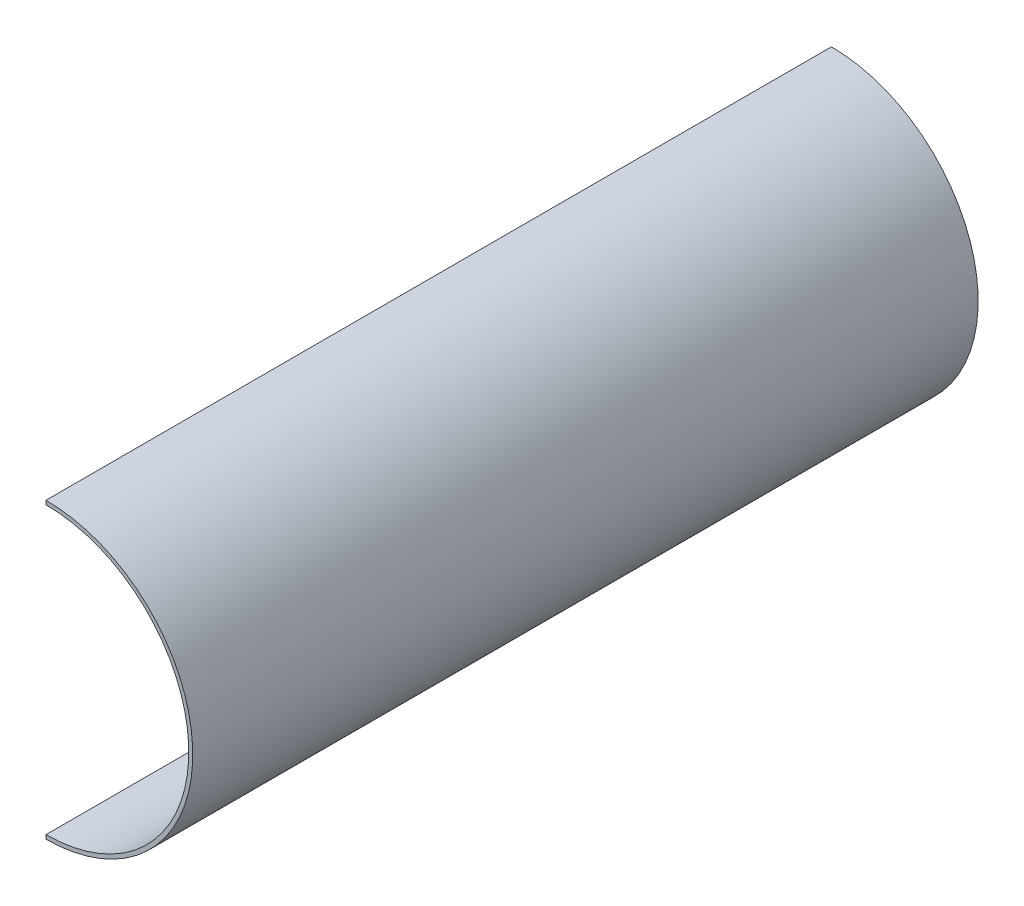
ISO-10303-21;
HEADER;
FILE_DESCRIPTION(('STEP AP214'),'2;1');
FILE_NAME('part.step','',(''),(''),'','','');
FILE_SCHEMA(('AUTOMOTIVE_DESIGN { 1 0 10303 214 1 1 1 1 }'));
ENDSEC;
DATA;
#1=APPLICATION_CONTEXT('core data for automotive mechanical design processes');
#2=APPLICATION_PROTOCOL_DEFINITION('international standard','automotive_design',2000,#1);
#3=PRODUCT_CONTEXT('',#1,'mechanical');
#4=PRODUCT('Part','Part','',(#3));
#5=PRODUCT_RELATED_PRODUCT_CATEGORY('part','',(#4));
#6=PRODUCT_DEFINITION_FORMATION('','',#4);
#7=PRODUCT_DEFINITION_CONTEXT('part definition',#1,'design');
#8=PRODUCT_DEFINITION('design','',#6,#7);
#9=PRODUCT_DEFINITION_SHAPE('','',#8);
#10=(LENGTH_UNIT() NAMED_UNIT(*) SI_UNIT(.MILLI.,.METRE.));
#11=(NAMED_UNIT(*) PLANE_ANGLE_UNIT() SI_UNIT($,.RADIAN.));
#12=(NAMED_UNIT(*) SI_UNIT($,.STERADIAN.) SOLID_ANGLE_UNIT());
#13=UNCERTAINTY_MEASURE_WITH_UNIT(LENGTH_MEASURE(1.E-05),#10,'distance_accuracy_value','');
#14=(GEOMETRIC_REPRESENTATION_CONTEXT(3) GLOBAL_UNCERTAINTY_ASSIGNED_CONTEXT((#13)) GLOBAL_UNIT_ASSIGNED_CONTEXT((#10,
#11,#12)) REPRESENTATION_CONTEXT('',''));
#15=CARTESIAN_POINT('',(0.,0.,0.));
#16=DIRECTION('',(0.,0.,1.));
#17=DIRECTION('',(1.,0.,0.));
#18=AXIS2_PLACEMENT_3D('',#15,#16,#17);
#19=CARTESIAN_POINT('',(0.,0.,99.));
#20=DIRECTION('',(0.,0.,-1.));
#21=DIRECTION('',(-1.,0.,0.));
#22=AXIS2_PLACEMENT_3D('',#19,#20,#21);
#23=CYLINDRICAL_SURFACE('',#22,18.5);
#24=CARTESIAN_POINT('',(0.,0.,0.));
#25=DIRECTION('',(0.,0.,1.));
#26=DIRECTION('',(1.,0.,0.));
#27=AXIS2_PLACEMENT_3D('',#24,#25,#26);
#28=CIRCLE('',#27,18.5);
#29=CARTESIAN_POINT('',(0.,-18.5,0.));
#30=VERTEX_POINT('',#29);
#31=CARTESIAN_POINT('',(0.,18.5,0.));
#32=VERTEX_POINT('',#31);
#33=EDGE_CURVE('E40',#30,#32,#28,.T.);
#34=ORIENTED_EDGE('',*,*,#33,.T.);
#35=DIRECTION('',(0.,0.,1.));
#36=VECTOR('',#35,1.);
#37=CARTESIAN_POINT('',(0.,18.5,0.));
#38=LINE('',#37,#36);
#39=CARTESIAN_POINT('',(0.,18.5,99.));
#40=VERTEX_POINT('',#39);
#41=EDGE_CURVE('E60',#32,#40,#38,.T.);
#42=ORIENTED_EDGE('',*,*,#41,.T.);
#43=CARTESIAN_POINT('',(0.,0.,99.));
#44=DIRECTION('',(0.,0.,1.));
#45=DIRECTION('',(1.,0.,0.));
#46=AXIS2_PLACEMENT_3D('',#43,#44,#45);
#47=CIRCLE('',#46,18.5);
#48=CARTESIAN_POINT('',(0.,-18.5,99.));
#49=VERTEX_POINT('',#48);
#50=EDGE_CURVE('E11',#49,#40,#47,.T.);
#51=ORIENTED_EDGE('',*,*,#50,.F.);
#52=DIRECTION('',(0.,0.,1.));
#53=VECTOR('',#52,1.);
#54=CARTESIAN_POINT('',(0.,-18.5,0.));
#55=LINE('',#54,#53);
#56=EDGE_CURVE('E83',#30,#49,#55,.T.);
#57=ORIENTED_EDGE('',*,*,#56,.F.);
#58=EDGE_LOOP('',(#34,#42,#51,#57));
#59=FACE_BOUND('',#58,.T.);
#60=ADVANCED_FACE('F37',(#59),#23,.T.);
#61=CARTESIAN_POINT('',(0.,0.,99.));
#62=DIRECTION('',(0.,0.,1.));
#63=DIRECTION('',(1.,0.,0.));
#64=AXIS2_PLACEMENT_3D('',#61,#62,#63);
#65=PLANE('',#64);
#66=DIRECTION('',(0.,1.,0.));
#67=VECTOR('',#66,1.);
#68=CARTESIAN_POINT('',(0.,18.5,99.));
#69=LINE('',#68,#67);
#70=CARTESIAN_POINT('',(0.,18.,99.));
#71=VERTEX_POINT('',#70);
#72=EDGE_CURVE('E75',#71,#40,#69,.T.);
#73=ORIENTED_EDGE('',*,*,#72,.F.);
#74=CARTESIAN_POINT('',(0.,0.,99.));
#75=DIRECTION('',(0.,0.,1.));
#76=DIRECTION('',(1.,0.,0.));
#77=AXIS2_PLACEMENT_3D('',#74,#75,#76);
#78=CIRCLE('',#77,18.);
#79=CARTESIAN_POINT('',(0.,-18.,99.));
#80=VERTEX_POINT('',#79);
#81=EDGE_CURVE('E104',#80,#71,#78,.T.);
#82=ORIENTED_EDGE('',*,*,#81,.F.);
#83=DIRECTION('',(0.,1.,0.));
#84=VECTOR('',#83,1.);
#85=CARTESIAN_POINT('',(0.,-18.,99.));
#86=LINE('',#85,#84);
#87=EDGE_CURVE('E105',#49,#80,#86,.T.);
#88=ORIENTED_EDGE('',*,*,#87,.F.);
#89=ORIENTED_EDGE('',*,*,#50,.T.);
#90=EDGE_LOOP('',(#73,#82,#88,#89));
#91=FACE_BOUND('',#90,.T.);
#92=ADVANCED_FACE('F108',(#91),#65,.T.);
#93=CARTESIAN_POINT('',(0.,0.,0.));
#94=DIRECTION('',(0.,0.,1.));
#95=DIRECTION('',(1.,0.,0.));
#96=AXIS2_PLACEMENT_3D('',#93,#94,#95);
#97=PLANE('',#96);
#98=CARTESIAN_POINT('',(0.,0.,0.));
#99=DIRECTION('',(0.,0.,1.));
#100=DIRECTION('',(1.,0.,0.));
#101=AXIS2_PLACEMENT_3D('',#98,#99,#100);
#102=CIRCLE('',#101,18.);
#103=CARTESIAN_POINT('',(0.,-18.,0.));
#104=VERTEX_POINT('',#103);
#105=CARTESIAN_POINT('',(0.,18.,0.));
#106=VERTEX_POINT('',#105);
#107=EDGE_CURVE('E51',#104,#106,#102,.T.);
#108=ORIENTED_EDGE('',*,*,#107,.T.);
#109=DIRECTION('',(0.,1.,0.));
#110=VECTOR('',#109,1.);
#111=CARTESIAN_POINT('',(0.,18.5,0.));
#112=LINE('',#111,#110);
#113=EDGE_CURVE('E92',#106,#32,#112,.T.);
#114=ORIENTED_EDGE('',*,*,#113,.T.);
#115=ORIENTED_EDGE('',*,*,#33,.F.);
#116=DIRECTION('',(0.,1.,0.));
#117=VECTOR('',#116,1.);
#118=CARTESIAN_POINT('',(0.,-18.,0.));
#119=LINE('',#118,#117);
#120=EDGE_CURVE('E79',#30,#104,#119,.T.);
#121=ORIENTED_EDGE('',*,*,#120,.T.);
#122=EDGE_LOOP('',(#108,#114,#115,#121));
#123=FACE_BOUND('',#122,.T.);
#124=ADVANCED_FACE('F94',(#123),#97,.F.);
#125=CARTESIAN_POINT('',(0.,18.5,0.));
#126=DIRECTION('',(1.,0.,0.));
#127=DIRECTION('',(0.,0.,-1.));
#128=AXIS2_PLACEMENT_3D('',#125,#126,#127);
#129=PLANE('',#128);
#130=ORIENTED_EDGE('',*,*,#72,.T.);
#131=ORIENTED_EDGE('',*,*,#41,.F.);
#132=ORIENTED_EDGE('',*,*,#113,.F.);
#133=DIRECTION('',(0.,0.,1.));
#134=VECTOR('',#133,1.);
#135=CARTESIAN_POINT('',(0.,18.,0.));
#136=LINE('',#135,#134);
#137=EDGE_CURVE('E95',#106,#71,#136,.T.);
#138=ORIENTED_EDGE('',*,*,#137,.T.);
#139=EDGE_LOOP('',(#130,#131,#132,#138));
#140=FACE_BOUND('',#139,.T.);
#141=ADVANCED_FACE('F117',(#140),#129,.F.);
#142=CARTESIAN_POINT('',(0.,0.,0.));
#143=DIRECTION('',(0.,0.,1.));
#144=DIRECTION('',(1.,0.,0.));
#145=AXIS2_PLACEMENT_3D('',#142,#143,#144);
#146=CYLINDRICAL_SURFACE('',#145,18.);
#147=ORIENTED_EDGE('',*,*,#81,.T.);
#148=ORIENTED_EDGE('',*,*,#137,.F.);
#149=ORIENTED_EDGE('',*,*,#107,.F.);
#150=DIRECTION('',(0.,0.,1.));
#151=VECTOR('',#150,1.);
#152=CARTESIAN_POINT('',(0.,-18.,0.));
#153=LINE('',#152,#151);
#154=EDGE_CURVE('E85',#104,#80,#153,.T.);
#155=ORIENTED_EDGE('',*,*,#154,.T.);
#156=EDGE_LOOP('',(#147,#148,#149,#155));
#157=FACE_BOUND('',#156,.T.);
#158=ADVANCED_FACE('F102',(#157),#146,.F.);
#159=CARTESIAN_POINT('',(0.,-18.,0.));
#160=DIRECTION('',(1.,0.,0.));
#161=DIRECTION('',(0.,0.,-1.));
#162=AXIS2_PLACEMENT_3D('',#159,#160,#161);
#163=PLANE('',#162);
#164=ORIENTED_EDGE('',*,*,#87,.T.);
#165=ORIENTED_EDGE('',*,*,#154,.F.);
#166=ORIENTED_EDGE('',*,*,#120,.F.);
#167=ORIENTED_EDGE('',*,*,#56,.T.);
#168=EDGE_LOOP('',(#164,#165,#166,#167));
#169=FACE_BOUND('',#168,.T.);
#170=ADVANCED_FACE('F82',(#169),#163,.F.);
#171=CLOSED_SHELL('',(#60,#92,#124,#141,#158,#170));
#172=MANIFOLD_SOLID_BREP('B2',#171);
#173=ADVANCED_BREP_SHAPE_REPRESENTATION('',(#18,#172),#14);
#174=SHAPE_DEFINITION_REPRESENTATION(#9,#173);
ENDSEC;
END-ISO-10303-21;
